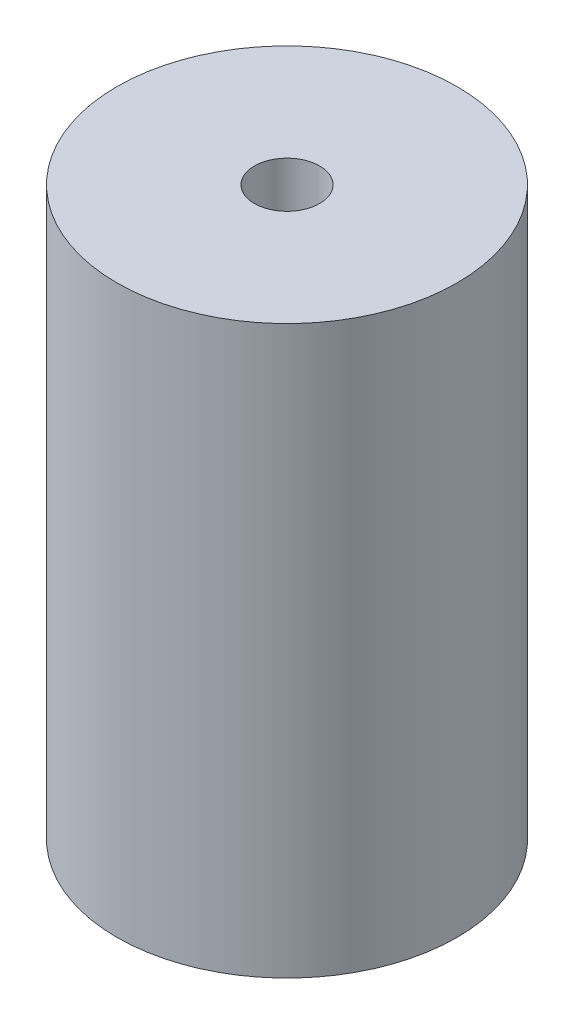
ISO-10303-21;
HEADER;
FILE_DESCRIPTION(('STEP AP214'),'2;1');
FILE_NAME('part.step','',(''),(''),'','','');
FILE_SCHEMA(('AUTOMOTIVE_DESIGN { 1 0 10303 214 1 1 1 1 }'));
ENDSEC;
DATA;
#1=APPLICATION_CONTEXT('core data for automotive mechanical design processes');
#2=APPLICATION_PROTOCOL_DEFINITION('international standard','automotive_design',2000,#1);
#3=PRODUCT_CONTEXT('',#1,'mechanical');
#4=PRODUCT('Part','Part','',(#3));
#5=PRODUCT_RELATED_PRODUCT_CATEGORY('part','',(#4));
#6=PRODUCT_DEFINITION_FORMATION('','',#4);
#7=PRODUCT_DEFINITION_CONTEXT('part definition',#1,'design');
#8=PRODUCT_DEFINITION('design','',#6,#7);
#9=PRODUCT_DEFINITION_SHAPE('','',#8);
#10=(LENGTH_UNIT() NAMED_UNIT(*) SI_UNIT(.MILLI.,.METRE.));
#11=(NAMED_UNIT(*) PLANE_ANGLE_UNIT() SI_UNIT($,.RADIAN.));
#12=(NAMED_UNIT(*) SI_UNIT($,.STERADIAN.) SOLID_ANGLE_UNIT());
#13=UNCERTAINTY_MEASURE_WITH_UNIT(LENGTH_MEASURE(1.E-05),#10,'distance_accuracy_value','');
#14=(GEOMETRIC_REPRESENTATION_CONTEXT(3) GLOBAL_UNCERTAINTY_ASSIGNED_CONTEXT((#13)) GLOBAL_UNIT_ASSIGNED_CONTEXT((#10,
#11,#12)) REPRESENTATION_CONTEXT('',''));
#15=CARTESIAN_POINT('',(0.,0.,0.));
#16=DIRECTION('',(0.,0.,1.));
#17=DIRECTION('',(1.,0.,0.));
#18=AXIS2_PLACEMENT_3D('',#15,#16,#17);
#19=CARTESIAN_POINT('',(0.,20.,0.));
#20=DIRECTION('',(0.,-1.,0.));
#21=DIRECTION('',(0.,0.,-1.));
#22=AXIS2_PLACEMENT_3D('',#19,#20,#21);
#23=CYLINDRICAL_SURFACE('',#22,6.);
#24=CARTESIAN_POINT('',(0.,20.,0.));
#25=DIRECTION('',(0.,1.,0.));
#26=DIRECTION('',(0.,0.,1.));
#27=AXIS2_PLACEMENT_3D('',#24,#25,#26);
#28=CIRCLE('',#27,6.);
#29=CARTESIAN_POINT('',(0.,20.,6.));
#30=VERTEX_POINT('',#29);
#31=EDGE_CURVE('E10',#30,#30,#28,.T.);
#32=ORIENTED_EDGE('',*,*,#31,.F.);
#33=EDGE_LOOP('',(#32));
#34=FACE_BOUND('',#33,.T.);
#35=CARTESIAN_POINT('',(0.,0.,0.));
#36=DIRECTION('',(0.,1.,0.));
#37=DIRECTION('',(0.,0.,1.));
#38=AXIS2_PLACEMENT_3D('',#35,#36,#37);
#39=CIRCLE('',#38,6.);
#40=CARTESIAN_POINT('',(0.,0.,6.));
#41=VERTEX_POINT('',#40);
#42=EDGE_CURVE('E40',#41,#41,#39,.T.);
#43=ORIENTED_EDGE('',*,*,#42,.T.);
#44=EDGE_LOOP('',(#43));
#45=FACE_BOUND('',#44,.T.);
#46=ADVANCED_FACE('F37',(#34,#45),#23,.T.);
#47=CARTESIAN_POINT('',(0.,20.,0.));
#48=DIRECTION('',(0.,1.,0.));
#49=DIRECTION('',(0.,0.,1.));
#50=AXIS2_PLACEMENT_3D('',#47,#48,#49);
#51=PLANE('',#50);
#52=CARTESIAN_POINT('',(0.,20.,0.));
#53=DIRECTION('',(0.,1.,0.));
#54=DIRECTION('',(0.,0.,1.));
#55=AXIS2_PLACEMENT_3D('',#52,#53,#54);
#56=CIRCLE('',#55,1.15);
#57=CARTESIAN_POINT('',(0.,20.,1.15));
#58=VERTEX_POINT('',#57);
#59=EDGE_CURVE('E51',#58,#58,#56,.T.);
#60=ORIENTED_EDGE('',*,*,#59,.F.);
#61=EDGE_LOOP('',(#60));
#62=FACE_BOUND('',#61,.T.);
#63=ORIENTED_EDGE('',*,*,#31,.T.);
#64=EDGE_LOOP('',(#63));
#65=FACE_BOUND('',#64,.T.);
#66=ADVANCED_FACE('F80',(#62,#65),#51,.T.);
#67=CARTESIAN_POINT('',(0.,0.,0.));
#68=DIRECTION('',(0.,1.,0.));
#69=DIRECTION('',(0.,0.,1.));
#70=AXIS2_PLACEMENT_3D('',#67,#68,#69);
#71=PLANE('',#70);
#72=CARTESIAN_POINT('',(0.,0.,0.));
#73=DIRECTION('',(0.,-1.,0.));
#74=DIRECTION('',(0.,0.,-1.));
#75=AXIS2_PLACEMENT_3D('',#72,#73,#74);
#76=CIRCLE('',#75,2.5);
#77=CARTESIAN_POINT('',(0.,0.,-2.5));
#78=VERTEX_POINT('',#77);
#79=EDGE_CURVE('E59',#78,#78,#76,.T.);
#80=ORIENTED_EDGE('',*,*,#79,.F.);
#81=EDGE_LOOP('',(#80));
#82=FACE_BOUND('',#81,.T.);
#83=ORIENTED_EDGE('',*,*,#42,.F.);
#84=EDGE_LOOP('',(#83));
#85=FACE_BOUND('',#84,.T.);
#86=ADVANCED_FACE('F76',(#82,#85),#71,.F.);
#87=CARTESIAN_POINT('',(0.,15.,0.));
#88=DIRECTION('',(0.,1.,0.));
#89=DIRECTION('',(0.,0.,1.));
#90=AXIS2_PLACEMENT_3D('',#87,#88,#89);
#91=CYLINDRICAL_SURFACE('',#90,1.15);
#92=CARTESIAN_POINT('',(0.,15.,0.));
#93=DIRECTION('',(0.,1.,0.));
#94=DIRECTION('',(0.,0.,1.));
#95=AXIS2_PLACEMENT_3D('',#92,#93,#94);
#96=CIRCLE('',#95,1.15);
#97=CARTESIAN_POINT('',(0.,15.,1.15));
#98=VERTEX_POINT('',#97);
#99=EDGE_CURVE('E49',#98,#98,#96,.T.);
#100=ORIENTED_EDGE('',*,*,#99,.F.);
#101=EDGE_LOOP('',(#100));
#102=FACE_BOUND('',#101,.T.);
#103=ORIENTED_EDGE('',*,*,#59,.T.);
#104=EDGE_LOOP('',(#103));
#105=FACE_BOUND('',#104,.T.);
#106=ADVANCED_FACE('F79',(#102,#105),#91,.F.);
#107=CARTESIAN_POINT('',(0.,15.,0.));
#108=DIRECTION('',(0.,1.,0.));
#109=DIRECTION('',(0.,0.,1.));
#110=AXIS2_PLACEMENT_3D('',#107,#108,#109);
#111=PLANE('',#110);
#112=ORIENTED_EDGE('',*,*,#99,.T.);
#113=EDGE_LOOP('',(#112));
#114=FACE_BOUND('',#113,.T.);
#115=ADVANCED_FACE('F72',(#114),#111,.T.);
#116=CARTESIAN_POINT('',(0.,5.,0.));
#117=DIRECTION('',(0.,-1.,0.));
#118=DIRECTION('',(0.,0.,-1.));
#119=AXIS2_PLACEMENT_3D('',#116,#117,#118);
#120=CYLINDRICAL_SURFACE('',#119,2.5);
#121=CARTESIAN_POINT('',(0.,5.,0.));
#122=DIRECTION('',(0.,-1.,0.));
#123=DIRECTION('',(0.,0.,-1.));
#124=AXIS2_PLACEMENT_3D('',#121,#122,#123);
#125=CIRCLE('',#124,2.5);
#126=CARTESIAN_POINT('',(0.,5.,-2.5));
#127=VERTEX_POINT('',#126);
#128=EDGE_CURVE('E55',#127,#127,#125,.T.);
#129=ORIENTED_EDGE('',*,*,#128,.F.);
#130=EDGE_LOOP('',(#129));
#131=FACE_BOUND('',#130,.T.);
#132=ORIENTED_EDGE('',*,*,#79,.T.);
#133=EDGE_LOOP('',(#132));
#134=FACE_BOUND('',#133,.T.);
#135=ADVANCED_FACE('F69',(#131,#134),#120,.F.);
#136=CARTESIAN_POINT('',(0.,5.,0.));
#137=DIRECTION('',(0.,-1.,0.));
#138=DIRECTION('',(0.,0.,-1.));
#139=AXIS2_PLACEMENT_3D('',#136,#137,#138);
#140=PLANE('',#139);
#141=ORIENTED_EDGE('',*,*,#128,.T.);
#142=EDGE_LOOP('',(#141));
#143=FACE_BOUND('',#142,.T.);
#144=ADVANCED_FACE('F67',(#143),#140,.T.);
#145=CLOSED_SHELL('',(#46,#66,#86,#106,#115,#135,#144));
#146=MANIFOLD_SOLID_BREP('B2',#145);
#147=ADVANCED_BREP_SHAPE_REPRESENTATION('',(#18,#146),#14);
#148=SHAPE_DEFINITION_REPRESENTATION(#9,#147);
ENDSEC;
END-ISO-10303-21;
